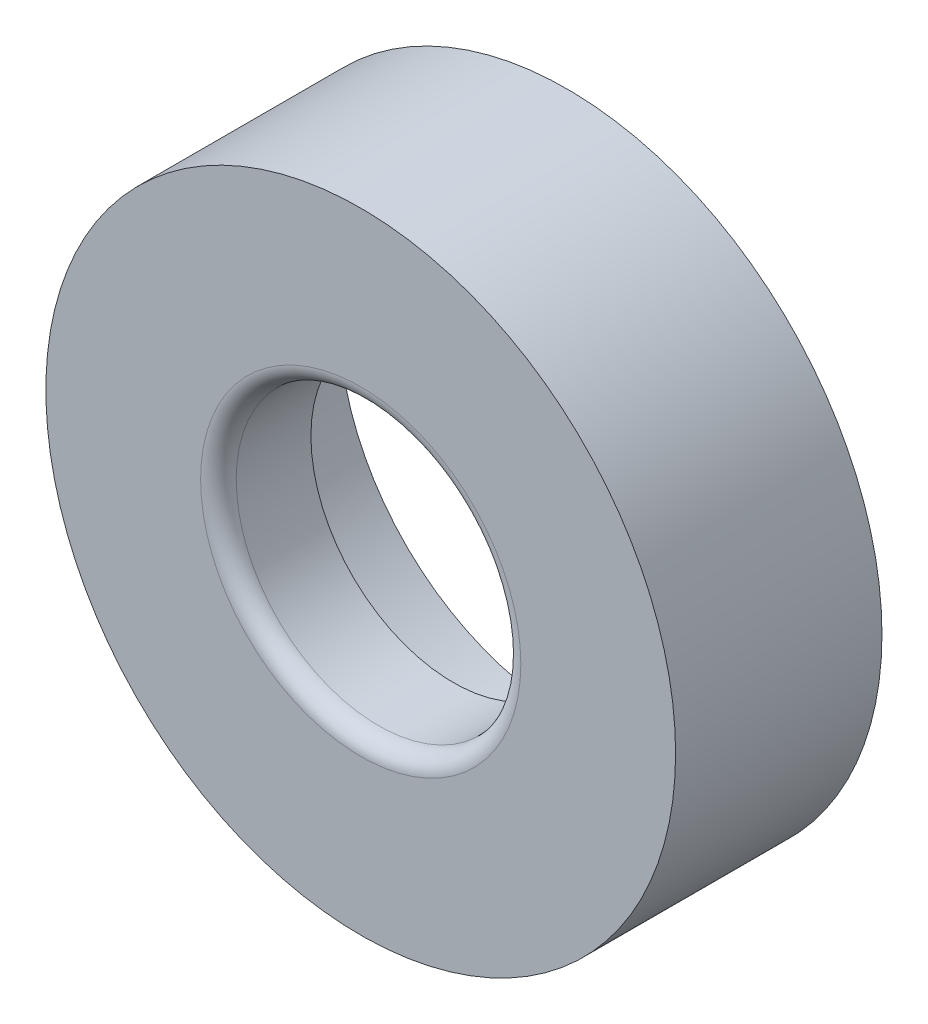
ISO-10303-21;
HEADER;
FILE_DESCRIPTION(('STEP AP214'),'2;1');
FILE_NAME('part.step','',(''),(''),'','','');
FILE_SCHEMA(('AUTOMOTIVE_DESIGN { 1 0 10303 214 1 1 1 1 }'));
ENDSEC;
DATA;
#1=APPLICATION_CONTEXT('core data for automotive mechanical design processes');
#2=APPLICATION_PROTOCOL_DEFINITION('international standard','automotive_design',2000,#1);
#3=PRODUCT_CONTEXT('',#1,'mechanical');
#4=PRODUCT('Part','Part','',(#3));
#5=PRODUCT_RELATED_PRODUCT_CATEGORY('part','',(#4));
#6=PRODUCT_DEFINITION_FORMATION('','',#4);
#7=PRODUCT_DEFINITION_CONTEXT('part definition',#1,'design');
#8=PRODUCT_DEFINITION('design','',#6,#7);
#9=PRODUCT_DEFINITION_SHAPE('','',#8);
#10=(LENGTH_UNIT() NAMED_UNIT(*) SI_UNIT(.MILLI.,.METRE.));
#11=(NAMED_UNIT(*) PLANE_ANGLE_UNIT() SI_UNIT($,.RADIAN.));
#12=(NAMED_UNIT(*) SI_UNIT($,.STERADIAN.) SOLID_ANGLE_UNIT());
#13=UNCERTAINTY_MEASURE_WITH_UNIT(LENGTH_MEASURE(1.E-05),#10,'distance_accuracy_value','');
#14=(GEOMETRIC_REPRESENTATION_CONTEXT(3) GLOBAL_UNCERTAINTY_ASSIGNED_CONTEXT((#13)) GLOBAL_UNIT_ASSIGNED_CONTEXT((#10,
#11,#12)) REPRESENTATION_CONTEXT('',''));
#15=CARTESIAN_POINT('',(0.,0.,0.));
#16=DIRECTION('',(0.,0.,1.));
#17=DIRECTION('',(1.,0.,0.));
#18=AXIS2_PLACEMENT_3D('',#15,#16,#17);
#19=CARTESIAN_POINT('',(85.2065274133614,-1.76399781545092,0.));
#20=DIRECTION('',(0.,0.,1.));
#21=DIRECTION('',(1.,0.,0.));
#22=AXIS2_PLACEMENT_3D('',#19,#20,#21);
#23=CYLINDRICAL_SURFACE('',#22,4.00000000000001);
#24=CARTESIAN_POINT('',(85.2065274133614,-1.76399781545092,5.3));
#25=DIRECTION('',(0.,0.,1.));
#26=DIRECTION('',(1.,0.,0.));
#27=AXIS2_PLACEMENT_3D('',#24,#25,#26);
#28=CIRCLE('',#27,4.00000000000001);
#29=CARTESIAN_POINT('',(89.2065274133614,-1.76399781545092,5.3));
#30=VERTEX_POINT('',#29);
#31=EDGE_CURVE('E47',#30,#30,#28,.T.);
#32=ORIENTED_EDGE('',*,*,#31,.T.);
#33=EDGE_LOOP('',(#32));
#34=FACE_BOUND('',#33,.T.);
#35=CARTESIAN_POINT('',(85.2065274133614,-1.76399781545092,3.2));
#36=DIRECTION('',(0.,0.,-1.));
#37=DIRECTION('',(-1.,0.,0.));
#38=AXIS2_PLACEMENT_3D('',#35,#36,#37);
#39=CIRCLE('',#38,4.00000000000001);
#40=CARTESIAN_POINT('',(81.2065274133614,-1.76399781545092,3.2));
#41=VERTEX_POINT('',#40);
#42=EDGE_CURVE('E60',#41,#41,#39,.F.);
#43=ORIENTED_EDGE('',*,*,#42,.F.);
#44=EDGE_LOOP('',(#43));
#45=FACE_BOUND('',#44,.T.);
#46=ADVANCED_FACE('F39',(#34,#45),#23,.F.);
#47=CARTESIAN_POINT('',(85.2065274133614,-1.76399781545092,5.8));
#48=DIRECTION('',(0.,0.,-1.));
#49=DIRECTION('',(-1.,0.,0.));
#50=AXIS2_PLACEMENT_3D('',#47,#48,#49);
#51=CYLINDRICAL_SURFACE('',#50,8.85);
#52=CARTESIAN_POINT('',(85.2065274133614,-1.76399781545092,5.8));
#53=DIRECTION('',(0.,0.,1.));
#54=DIRECTION('',(1.,0.,0.));
#55=AXIS2_PLACEMENT_3D('',#52,#53,#54);
#56=CIRCLE('',#55,8.85);
#57=CARTESIAN_POINT('',(94.0565274133614,-1.76399781545092,5.8));
#58=VERTEX_POINT('',#57);
#59=EDGE_CURVE('E52',#58,#58,#56,.T.);
#60=ORIENTED_EDGE('',*,*,#59,.F.);
#61=EDGE_LOOP('',(#60));
#62=FACE_BOUND('',#61,.T.);
#63=CARTESIAN_POINT('',(85.2065274133614,-1.76399781545092,0.));
#64=DIRECTION('',(0.,0.,1.));
#65=DIRECTION('',(1.,0.,0.));
#66=AXIS2_PLACEMENT_3D('',#63,#64,#65);
#67=CIRCLE('',#66,8.85);
#68=CARTESIAN_POINT('',(94.0565274133614,-1.76399781545092,0.));
#69=VERTEX_POINT('',#68);
#70=EDGE_CURVE('E57',#69,#69,#67,.T.);
#71=ORIENTED_EDGE('',*,*,#70,.T.);
#72=EDGE_LOOP('',(#71));
#73=FACE_BOUND('',#72,.T.);
#74=ADVANCED_FACE('F92',(#62,#73),#51,.T.);
#75=CARTESIAN_POINT('',(85.2065274133614,-1.76399781545092,5.8));
#76=DIRECTION('',(0.,0.,1.));
#77=DIRECTION('',(1.,0.,0.));
#78=AXIS2_PLACEMENT_3D('',#75,#76,#77);
#79=PLANE('',#78);
#80=CARTESIAN_POINT('',(85.2065274133614,-1.76399781545092,5.8));
#81=DIRECTION('',(0.,0.,1.));
#82=DIRECTION('',(1.,0.,0.));
#83=AXIS2_PLACEMENT_3D('',#80,#81,#82);
#84=CIRCLE('',#83,4.50000000000001);
#85=CARTESIAN_POINT('',(89.7065274133614,-1.76399781545092,5.8));
#86=VERTEX_POINT('',#85);
#87=EDGE_CURVE('E10',#86,#86,#84,.F.);
#88=ORIENTED_EDGE('',*,*,#87,.T.);
#89=EDGE_LOOP('',(#88));
#90=FACE_BOUND('',#89,.T.);
#91=ORIENTED_EDGE('',*,*,#59,.T.);
#92=EDGE_LOOP('',(#91));
#93=FACE_BOUND('',#92,.T.);
#94=ADVANCED_FACE('F88',(#90,#93),#79,.T.);
#95=CARTESIAN_POINT('',(85.2065274133614,-1.76399781545092,0.));
#96=DIRECTION('',(0.,0.,1.));
#97=DIRECTION('',(1.,0.,0.));
#98=AXIS2_PLACEMENT_3D('',#95,#96,#97);
#99=PLANE('',#98);
#100=CARTESIAN_POINT('',(85.2065274133614,-1.76399781545092,0.));
#101=DIRECTION('',(0.,0.,-1.));
#102=DIRECTION('',(-1.,0.,0.));
#103=AXIS2_PLACEMENT_3D('',#100,#101,#102);
#104=CIRCLE('',#103,6.40000000000001);
#105=CARTESIAN_POINT('',(78.8065274133614,-1.76399781545092,0.));
#106=VERTEX_POINT('',#105);
#107=EDGE_CURVE('E68',#106,#106,#104,.T.);
#108=ORIENTED_EDGE('',*,*,#107,.F.);
#109=EDGE_LOOP('',(#108));
#110=FACE_BOUND('',#109,.T.);
#111=ORIENTED_EDGE('',*,*,#70,.F.);
#112=EDGE_LOOP('',(#111));
#113=FACE_BOUND('',#112,.T.);
#114=ADVANCED_FACE('F85',(#110,#113),#99,.F.);
#115=CARTESIAN_POINT('',(85.2065274133614,-1.76399781545092,3.2));
#116=DIRECTION('',(0.,0.,-1.));
#117=DIRECTION('',(-1.,0.,0.));
#118=AXIS2_PLACEMENT_3D('',#115,#116,#117);
#119=PLANE('',#118);
#120=CARTESIAN_POINT('',(85.2065274133614,-1.76399781545092,3.2));
#121=DIRECTION('',(0.,0.,-1.));
#122=DIRECTION('',(-1.,0.,0.));
#123=AXIS2_PLACEMENT_3D('',#120,#121,#122);
#124=CIRCLE('',#123,6.40000000000001);
#125=CARTESIAN_POINT('',(78.8065274133614,-1.76399781545092,3.2));
#126=VERTEX_POINT('',#125);
#127=EDGE_CURVE('E64',#126,#126,#124,.T.);
#128=ORIENTED_EDGE('',*,*,#127,.T.);
#129=EDGE_LOOP('',(#128));
#130=FACE_BOUND('',#129,.T.);
#131=ORIENTED_EDGE('',*,*,#42,.T.);
#132=EDGE_LOOP('',(#131));
#133=FACE_BOUND('',#132,.T.);
#134=ADVANCED_FACE('F76',(#130,#133),#119,.T.);
#135=CARTESIAN_POINT('',(85.2065274133614,-1.76399781545092,3.2));
#136=DIRECTION('',(0.,0.,-1.));
#137=DIRECTION('',(-1.,0.,0.));
#138=AXIS2_PLACEMENT_3D('',#135,#136,#137);
#139=CYLINDRICAL_SURFACE('',#138,6.40000000000001);
#140=ORIENTED_EDGE('',*,*,#127,.F.);
#141=EDGE_LOOP('',(#140));
#142=FACE_BOUND('',#141,.T.);
#143=ORIENTED_EDGE('',*,*,#107,.T.);
#144=EDGE_LOOP('',(#143));
#145=FACE_BOUND('',#144,.T.);
#146=ADVANCED_FACE('F79',(#142,#145),#139,.F.);
#147=CARTESIAN_POINT('',(85.2065274133614,-1.76399781545092,5.3));
#148=DIRECTION('',(0.,0.,1.));
#149=DIRECTION('',(1.,0.,0.));
#150=AXIS2_PLACEMENT_3D('',#147,#148,#149);
#151=TOROIDAL_SURFACE('',#150,4.50000000000001,0.5);
#152=ORIENTED_EDGE('',*,*,#87,.F.);
#153=EDGE_LOOP('',(#152));
#154=FACE_BOUND('',#153,.T.);
#155=ORIENTED_EDGE('',*,*,#31,.F.);
#156=EDGE_LOOP('',(#155));
#157=FACE_BOUND('',#156,.T.);
#158=ADVANCED_FACE('F41',(#154,#157),#151,.T.);
#159=CLOSED_SHELL('',(#46,#74,#94,#114,#134,#146,#158));
#160=MANIFOLD_SOLID_BREP('B2',#159);
#161=ADVANCED_BREP_SHAPE_REPRESENTATION('',(#18,#160),#14);
#162=SHAPE_DEFINITION_REPRESENTATION(#9,#161);
ENDSEC;
END-ISO-10303-21;
